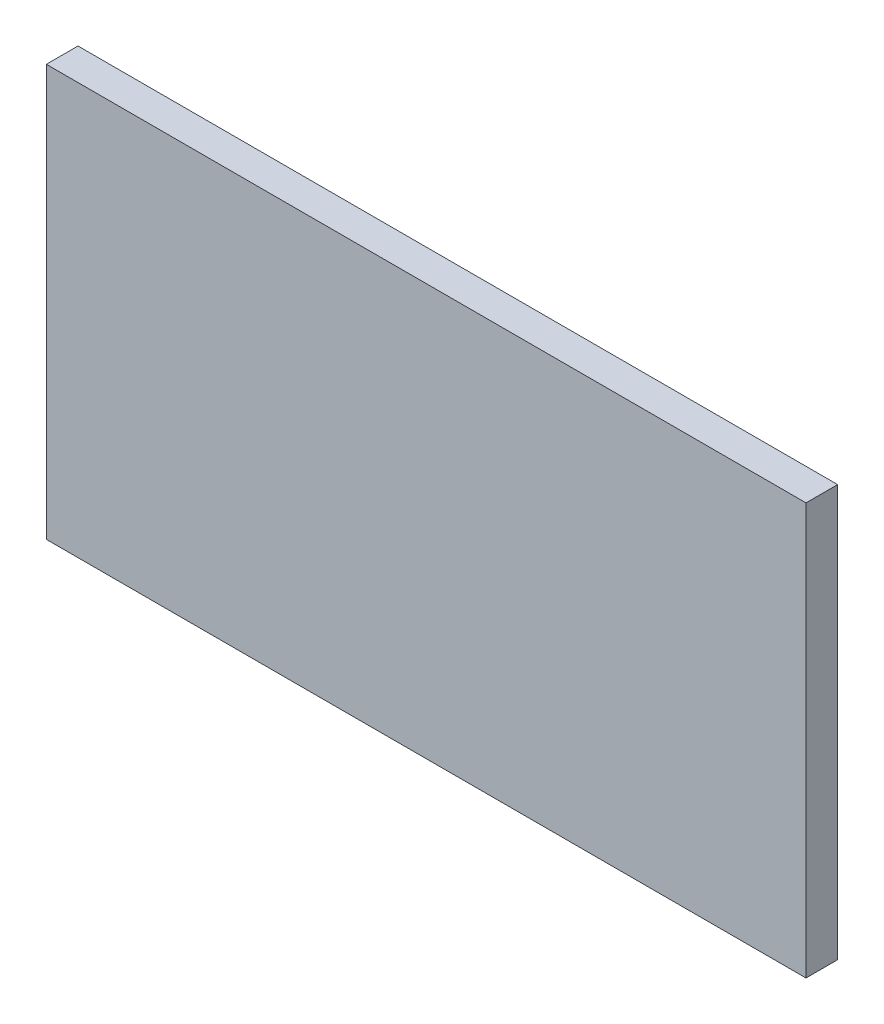
ISO-10303-21;
HEADER;
FILE_DESCRIPTION(('STEP AP214'),'2;1');
FILE_NAME('part.step','',(''),(''),'','','');
FILE_SCHEMA(('AUTOMOTIVE_DESIGN { 1 0 10303 214 1 1 1 1 }'));
ENDSEC;
DATA;
#1=APPLICATION_CONTEXT('core data for automotive mechanical design processes');
#2=APPLICATION_PROTOCOL_DEFINITION('international standard','automotive_design',2000,#1);
#3=PRODUCT_CONTEXT('',#1,'mechanical');
#4=PRODUCT('Part','Part','',(#3));
#5=PRODUCT_RELATED_PRODUCT_CATEGORY('part','',(#4));
#6=PRODUCT_DEFINITION_FORMATION('','',#4);
#7=PRODUCT_DEFINITION_CONTEXT('part definition',#1,'design');
#8=PRODUCT_DEFINITION('design','',#6,#7);
#9=PRODUCT_DEFINITION_SHAPE('','',#8);
#10=(LENGTH_UNIT() NAMED_UNIT(*) SI_UNIT(.MILLI.,.METRE.));
#11=(NAMED_UNIT(*) PLANE_ANGLE_UNIT() SI_UNIT($,.RADIAN.));
#12=(NAMED_UNIT(*) SI_UNIT($,.STERADIAN.) SOLID_ANGLE_UNIT());
#13=UNCERTAINTY_MEASURE_WITH_UNIT(LENGTH_MEASURE(1.E-05),#10,'distance_accuracy_value','');
#14=(GEOMETRIC_REPRESENTATION_CONTEXT(3) GLOBAL_UNCERTAINTY_ASSIGNED_CONTEXT((#13)) GLOBAL_UNIT_ASSIGNED_CONTEXT((#10,
#11,#12)) REPRESENTATION_CONTEXT('',''));
#15=CARTESIAN_POINT('',(0.,0.,0.));
#16=DIRECTION('',(0.,0.,1.));
#17=DIRECTION('',(1.,0.,0.));
#18=AXIS2_PLACEMENT_3D('',#15,#16,#17);
#19=CARTESIAN_POINT('',(0.,0.,1.));
#20=DIRECTION('',(-1.,0.,0.));
#21=DIRECTION('',(0.,-1.,0.));
#22=AXIS2_PLACEMENT_3D('',#19,#20,#21);
#23=PLANE('',#22);
#24=DIRECTION('',(0.,1.,0.));
#25=VECTOR('',#24,1.);
#26=CARTESIAN_POINT('',(0.,0.,0.));
#27=LINE('',#26,#25);
#28=CARTESIAN_POINT('',(0.,0.,0.));
#29=VERTEX_POINT('',#28);
#30=CARTESIAN_POINT('',(0.,13.,0.));
#31=VERTEX_POINT('',#30);
#32=EDGE_CURVE('E97',#29,#31,#27,.T.);
#33=ORIENTED_EDGE('',*,*,#32,.T.);
#34=DIRECTION('',(0.,0.,-1.));
#35=VECTOR('',#34,1.);
#36=CARTESIAN_POINT('',(0.,13.,1.));
#37=LINE('',#36,#35);
#38=CARTESIAN_POINT('',(0.,13.,1.));
#39=VERTEX_POINT('',#38);
#40=EDGE_CURVE('E11',#39,#31,#37,.T.);
#41=ORIENTED_EDGE('',*,*,#40,.F.);
#42=DIRECTION('',(0.,1.,0.));
#43=VECTOR('',#42,1.);
#44=CARTESIAN_POINT('',(0.,0.,1.));
#45=LINE('',#44,#43);
#46=CARTESIAN_POINT('',(0.,0.,1.));
#47=VERTEX_POINT('',#46);
#48=EDGE_CURVE('E85',#47,#39,#45,.T.);
#49=ORIENTED_EDGE('',*,*,#48,.F.);
#50=DIRECTION('',(0.,0.,-1.));
#51=VECTOR('',#50,1.);
#52=CARTESIAN_POINT('',(0.,0.,1.));
#53=LINE('',#52,#51);
#54=EDGE_CURVE('E93',#47,#29,#53,.T.);
#55=ORIENTED_EDGE('',*,*,#54,.T.);
#56=EDGE_LOOP('',(#33,#41,#49,#55));
#57=FACE_BOUND('',#56,.T.);
#58=ADVANCED_FACE('F34',(#57),#23,.F.);
#59=CARTESIAN_POINT('',(0.,13.,1.));
#60=DIRECTION('',(0.,-1.,0.));
#61=DIRECTION('',(1.,0.,0.));
#62=AXIS2_PLACEMENT_3D('',#59,#60,#61);
#63=PLANE('',#62);
#64=DIRECTION('',(-1.,0.,0.));
#65=VECTOR('',#64,1.);
#66=CARTESIAN_POINT('',(0.,13.,0.));
#67=LINE('',#66,#65);
#68=CARTESIAN_POINT('',(-24.,13.,0.));
#69=VERTEX_POINT('',#68);
#70=EDGE_CURVE('E89',#31,#69,#67,.T.);
#71=ORIENTED_EDGE('',*,*,#70,.T.);
#72=DIRECTION('',(0.,0.,-1.));
#73=VECTOR('',#72,1.);
#74=CARTESIAN_POINT('',(-24.,13.,1.));
#75=LINE('',#74,#73);
#76=CARTESIAN_POINT('',(-24.,13.,1.));
#77=VERTEX_POINT('',#76);
#78=EDGE_CURVE('E42',#77,#69,#75,.T.);
#79=ORIENTED_EDGE('',*,*,#78,.F.);
#80=DIRECTION('',(-1.,0.,0.));
#81=VECTOR('',#80,1.);
#82=CARTESIAN_POINT('',(0.,13.,1.));
#83=LINE('',#82,#81);
#84=EDGE_CURVE('E80',#39,#77,#83,.T.);
#85=ORIENTED_EDGE('',*,*,#84,.F.);
#86=ORIENTED_EDGE('',*,*,#40,.T.);
#87=EDGE_LOOP('',(#71,#79,#85,#86));
#88=FACE_BOUND('',#87,.T.);
#89=ADVANCED_FACE('F88',(#88),#63,.F.);
#90=CARTESIAN_POINT('',(-24.,0.,1.));
#91=DIRECTION('',(1.,0.,0.));
#92=DIRECTION('',(0.,0.,-1.));
#93=AXIS2_PLACEMENT_3D('',#90,#91,#92);
#94=PLANE('',#93);
#95=DIRECTION('',(0.,-1.,0.));
#96=VECTOR('',#95,1.);
#97=CARTESIAN_POINT('',(-24.,0.,0.));
#98=LINE('',#97,#96);
#99=CARTESIAN_POINT('',(-24.,0.,0.));
#100=VERTEX_POINT('',#99);
#101=EDGE_CURVE('E67',#69,#100,#98,.T.);
#102=ORIENTED_EDGE('',*,*,#101,.T.);
#103=DIRECTION('',(0.,0.,-1.));
#104=VECTOR('',#103,1.);
#105=CARTESIAN_POINT('',(-24.,0.,1.));
#106=LINE('',#105,#104);
#107=CARTESIAN_POINT('',(-24.,0.,1.));
#108=VERTEX_POINT('',#107);
#109=EDGE_CURVE('E90',#108,#100,#106,.T.);
#110=ORIENTED_EDGE('',*,*,#109,.F.);
#111=DIRECTION('',(0.,-1.,0.));
#112=VECTOR('',#111,1.);
#113=CARTESIAN_POINT('',(-24.,0.,1.));
#114=LINE('',#113,#112);
#115=EDGE_CURVE('E83',#77,#108,#114,.T.);
#116=ORIENTED_EDGE('',*,*,#115,.F.);
#117=ORIENTED_EDGE('',*,*,#78,.T.);
#118=EDGE_LOOP('',(#102,#110,#116,#117));
#119=FACE_BOUND('',#118,.T.);
#120=ADVANCED_FACE('F91',(#119),#94,.F.);
#121=CARTESIAN_POINT('',(0.,0.,1.));
#122=DIRECTION('',(0.,1.,0.));
#123=DIRECTION('',(-1.,0.,0.));
#124=AXIS2_PLACEMENT_3D('',#121,#122,#123);
#125=PLANE('',#124);
#126=DIRECTION('',(1.,0.,0.));
#127=VECTOR('',#126,1.);
#128=CARTESIAN_POINT('',(0.,0.,0.));
#129=LINE('',#128,#127);
#130=EDGE_CURVE('E73',#100,#29,#129,.T.);
#131=ORIENTED_EDGE('',*,*,#130,.T.);
#132=ORIENTED_EDGE('',*,*,#54,.F.);
#133=DIRECTION('',(1.,0.,0.));
#134=VECTOR('',#133,1.);
#135=CARTESIAN_POINT('',(0.,0.,1.));
#136=LINE('',#135,#134);
#137=EDGE_CURVE('E50',#108,#47,#136,.T.);
#138=ORIENTED_EDGE('',*,*,#137,.F.);
#139=ORIENTED_EDGE('',*,*,#109,.T.);
#140=EDGE_LOOP('',(#131,#132,#138,#139));
#141=FACE_BOUND('',#140,.T.);
#142=ADVANCED_FACE('F104',(#141),#125,.F.);
#143=CARTESIAN_POINT('',(0.,0.,1.));
#144=DIRECTION('',(0.,0.,1.));
#145=DIRECTION('',(1.,0.,0.));
#146=AXIS2_PLACEMENT_3D('',#143,#144,#145);
#147=PLANE('',#146);
#148=ORIENTED_EDGE('',*,*,#48,.T.);
#149=ORIENTED_EDGE('',*,*,#84,.T.);
#150=ORIENTED_EDGE('',*,*,#115,.T.);
#151=ORIENTED_EDGE('',*,*,#137,.T.);
#152=EDGE_LOOP('',(#148,#149,#150,#151));
#153=FACE_BOUND('',#152,.T.);
#154=ADVANCED_FACE('F81',(#153),#147,.T.);
#155=CARTESIAN_POINT('',(0.,0.,0.));
#156=DIRECTION('',(0.,0.,1.));
#157=DIRECTION('',(1.,0.,0.));
#158=AXIS2_PLACEMENT_3D('',#155,#156,#157);
#159=PLANE('',#158);
#160=ORIENTED_EDGE('',*,*,#32,.F.);
#161=ORIENTED_EDGE('',*,*,#130,.F.);
#162=ORIENTED_EDGE('',*,*,#101,.F.);
#163=ORIENTED_EDGE('',*,*,#70,.F.);
#164=EDGE_LOOP('',(#160,#161,#162,#163));
#165=FACE_BOUND('',#164,.T.);
#166=ADVANCED_FACE('F107',(#165),#159,.F.);
#167=CLOSED_SHELL('',(#58,#89,#120,#142,#154,#166));
#168=MANIFOLD_SOLID_BREP('B2',#167);
#169=ADVANCED_BREP_SHAPE_REPRESENTATION('',(#18,#168),#14);
#170=SHAPE_DEFINITION_REPRESENTATION(#9,#169);
ENDSEC;
END-ISO-10303-21;
